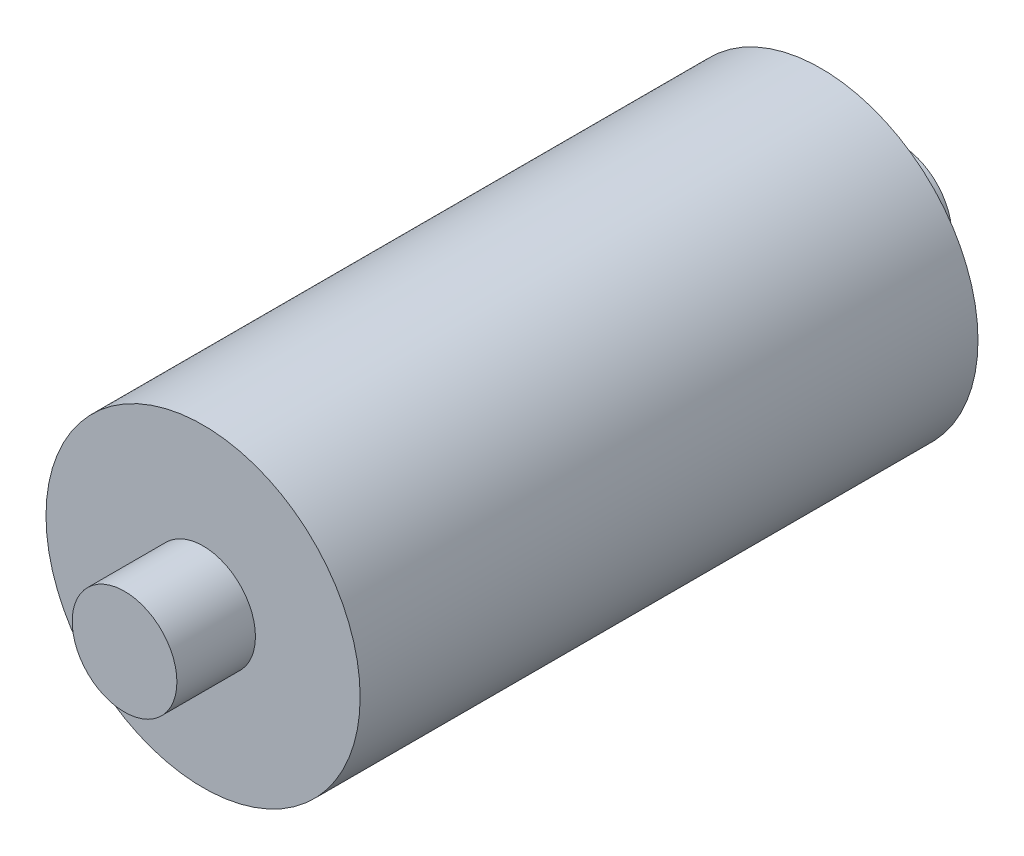
ISO-10303-21;
HEADER;
FILE_DESCRIPTION(('STEP AP214'),'2;1');
FILE_NAME('part.step','',(''),(''),'','','');
FILE_SCHEMA(('AUTOMOTIVE_DESIGN { 1 0 10303 214 1 1 1 1 }'));
ENDSEC;
DATA;
#1=APPLICATION_CONTEXT('core data for automotive mechanical design processes');
#2=APPLICATION_PROTOCOL_DEFINITION('international standard','automotive_design',2000,#1);
#3=PRODUCT_CONTEXT('',#1,'mechanical');
#4=PRODUCT('Part','Part','',(#3));
#5=PRODUCT_RELATED_PRODUCT_CATEGORY('part','',(#4));
#6=PRODUCT_DEFINITION_FORMATION('','',#4);
#7=PRODUCT_DEFINITION_CONTEXT('part definition',#1,'design');
#8=PRODUCT_DEFINITION('design','',#6,#7);
#9=PRODUCT_DEFINITION_SHAPE('','',#8);
#10=(LENGTH_UNIT() NAMED_UNIT(*) SI_UNIT(.MILLI.,.METRE.));
#11=(NAMED_UNIT(*) PLANE_ANGLE_UNIT() SI_UNIT($,.RADIAN.));
#12=(NAMED_UNIT(*) SI_UNIT($,.STERADIAN.) SOLID_ANGLE_UNIT());
#13=UNCERTAINTY_MEASURE_WITH_UNIT(LENGTH_MEASURE(1.E-05),#10,'distance_accuracy_value','');
#14=(GEOMETRIC_REPRESENTATION_CONTEXT(3) GLOBAL_UNCERTAINTY_ASSIGNED_CONTEXT((#13)) GLOBAL_UNIT_ASSIGNED_CONTEXT((#10,
#11,#12)) REPRESENTATION_CONTEXT('',''));
#15=CARTESIAN_POINT('',(0.,0.,0.));
#16=DIRECTION('',(0.,0.,1.));
#17=DIRECTION('',(1.,0.,0.));
#18=AXIS2_PLACEMENT_3D('',#15,#16,#17);
#19=CARTESIAN_POINT('',(0.,0.,29.5));
#20=DIRECTION('',(0.,0.,-1.));
#21=DIRECTION('',(-1.,0.,0.));
#22=AXIS2_PLACEMENT_3D('',#19,#20,#21);
#23=CYLINDRICAL_SURFACE('',#22,15.);
#24=CARTESIAN_POINT('',(0.,0.,29.5));
#25=DIRECTION('',(0.,0.,1.));
#26=DIRECTION('',(1.,0.,0.));
#27=AXIS2_PLACEMENT_3D('',#24,#25,#26);
#28=CIRCLE('',#27,15.);
#29=CARTESIAN_POINT('',(15.,0.,29.5));
#30=VERTEX_POINT('',#29);
#31=EDGE_CURVE('E43',#30,#30,#28,.T.);
#32=ORIENTED_EDGE('',*,*,#31,.F.);
#33=EDGE_LOOP('',(#32));
#34=FACE_BOUND('',#33,.T.);
#35=CARTESIAN_POINT('',(0.,0.,-29.5));
#36=DIRECTION('',(0.,0.,1.));
#37=DIRECTION('',(1.,0.,0.));
#38=AXIS2_PLACEMENT_3D('',#35,#36,#37);
#39=CIRCLE('',#38,15.);
#40=CARTESIAN_POINT('',(15.,0.,-29.5));
#41=VERTEX_POINT('',#40);
#42=EDGE_CURVE('E50',#41,#41,#39,.T.);
#43=ORIENTED_EDGE('',*,*,#42,.T.);
#44=EDGE_LOOP('',(#43));
#45=FACE_BOUND('',#44,.T.);
#46=ADVANCED_FACE('F40',(#34,#45),#23,.T.);
#47=CARTESIAN_POINT('',(0.,0.,29.5));
#48=DIRECTION('',(0.,0.,1.));
#49=DIRECTION('',(1.,0.,0.));
#50=AXIS2_PLACEMENT_3D('',#47,#48,#49);
#51=PLANE('',#50);
#52=CARTESIAN_POINT('',(0.,0.,29.5));
#53=DIRECTION('',(0.,0.,1.));
#54=DIRECTION('',(1.,0.,0.));
#55=AXIS2_PLACEMENT_3D('',#52,#53,#54);
#56=CIRCLE('',#55,5.);
#57=CARTESIAN_POINT('',(5.,0.,29.5));
#58=VERTEX_POINT('',#57);
#59=EDGE_CURVE('E55',#58,#58,#56,.F.);
#60=ORIENTED_EDGE('',*,*,#59,.T.);
#61=EDGE_LOOP('',(#60));
#62=FACE_BOUND('',#61,.T.);
#63=ORIENTED_EDGE('',*,*,#31,.T.);
#64=EDGE_LOOP('',(#63));
#65=FACE_BOUND('',#64,.T.);
#66=ADVANCED_FACE('F85',(#62,#65),#51,.T.);
#67=CARTESIAN_POINT('',(0.,0.,-29.5));
#68=DIRECTION('',(0.,0.,1.));
#69=DIRECTION('',(1.,0.,0.));
#70=AXIS2_PLACEMENT_3D('',#67,#68,#69);
#71=PLANE('',#70);
#72=CARTESIAN_POINT('',(0.,0.,-29.5));
#73=DIRECTION('',(0.,0.,1.));
#74=DIRECTION('',(1.,0.,0.));
#75=AXIS2_PLACEMENT_3D('',#72,#73,#74);
#76=CIRCLE('',#75,5.);
#77=CARTESIAN_POINT('',(5.,0.,-29.5));
#78=VERTEX_POINT('',#77);
#79=EDGE_CURVE('E10',#78,#78,#76,.F.);
#80=ORIENTED_EDGE('',*,*,#79,.F.);
#81=EDGE_LOOP('',(#80));
#82=FACE_BOUND('',#81,.T.);
#83=ORIENTED_EDGE('',*,*,#42,.F.);
#84=EDGE_LOOP('',(#83));
#85=FACE_BOUND('',#84,.T.);
#86=ADVANCED_FACE('F87',(#82,#85),#71,.F.);
#87=CARTESIAN_POINT('',(0.,0.,37.));
#88=DIRECTION('',(0.,0.,-1.));
#89=DIRECTION('',(-1.,0.,0.));
#90=AXIS2_PLACEMENT_3D('',#87,#88,#89);
#91=CYLINDRICAL_SURFACE('',#90,5.);
#92=ORIENTED_EDGE('',*,*,#59,.F.);
#93=EDGE_LOOP('',(#92));
#94=FACE_BOUND('',#93,.T.);
#95=CARTESIAN_POINT('',(0.,0.,37.));
#96=DIRECTION('',(0.,0.,1.));
#97=DIRECTION('',(1.,0.,0.));
#98=AXIS2_PLACEMENT_3D('',#95,#96,#97);
#99=CIRCLE('',#98,5.);
#100=CARTESIAN_POINT('',(5.,0.,37.));
#101=VERTEX_POINT('',#100);
#102=EDGE_CURVE('E54',#101,#101,#99,.T.);
#103=ORIENTED_EDGE('',*,*,#102,.F.);
#104=EDGE_LOOP('',(#103));
#105=FACE_BOUND('',#104,.T.);
#106=ADVANCED_FACE('F76',(#94,#105),#91,.T.);
#107=CARTESIAN_POINT('',(0.,0.,37.));
#108=DIRECTION('',(0.,0.,1.));
#109=DIRECTION('',(1.,0.,0.));
#110=AXIS2_PLACEMENT_3D('',#107,#108,#109);
#111=PLANE('',#110);
#112=ORIENTED_EDGE('',*,*,#102,.T.);
#113=EDGE_LOOP('',(#112));
#114=FACE_BOUND('',#113,.T.);
#115=ADVANCED_FACE('F72',(#114),#111,.T.);
#116=CARTESIAN_POINT('',(0.,0.,-37.));
#117=DIRECTION('',(0.,0.,1.));
#118=DIRECTION('',(1.,0.,0.));
#119=AXIS2_PLACEMENT_3D('',#116,#117,#118);
#120=CYLINDRICAL_SURFACE('',#119,5.);
#121=CARTESIAN_POINT('',(0.,0.,-37.));
#122=DIRECTION('',(0.,0.,-1.));
#123=DIRECTION('',(-1.,0.,0.));
#124=AXIS2_PLACEMENT_3D('',#121,#122,#123);
#125=CIRCLE('',#124,5.);
#126=CARTESIAN_POINT('',(-5.,0.,-37.));
#127=VERTEX_POINT('',#126);
#128=EDGE_CURVE('E62',#127,#127,#125,.T.);
#129=ORIENTED_EDGE('',*,*,#128,.F.);
#130=EDGE_LOOP('',(#129));
#131=FACE_BOUND('',#130,.T.);
#132=ORIENTED_EDGE('',*,*,#79,.T.);
#133=EDGE_LOOP('',(#132));
#134=FACE_BOUND('',#133,.T.);
#135=ADVANCED_FACE('F66',(#131,#134),#120,.T.);
#136=CARTESIAN_POINT('',(0.,0.,-37.));
#137=DIRECTION('',(0.,0.,-1.));
#138=DIRECTION('',(-1.,0.,0.));
#139=AXIS2_PLACEMENT_3D('',#136,#137,#138);
#140=PLANE('',#139);
#141=ORIENTED_EDGE('',*,*,#128,.T.);
#142=EDGE_LOOP('',(#141));
#143=FACE_BOUND('',#142,.T.);
#144=ADVANCED_FACE('F70',(#143),#140,.T.);
#145=CLOSED_SHELL('',(#46,#66,#86,#106,#115,#135,#144));
#146=MANIFOLD_SOLID_BREP('B2',#145);
#147=ADVANCED_BREP_SHAPE_REPRESENTATION('',(#18,#146),#14);
#148=SHAPE_DEFINITION_REPRESENTATION(#9,#147);
ENDSEC;
END-ISO-10303-21;
